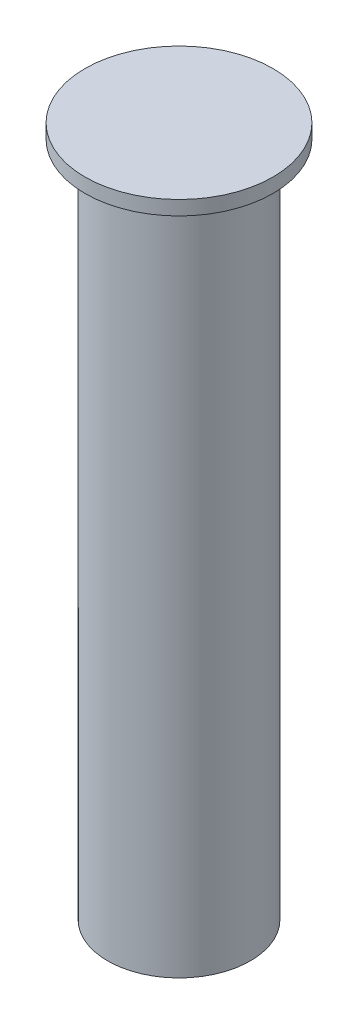
ISO-10303-21;
HEADER;
FILE_DESCRIPTION(('STEP AP214'),'2;1');
FILE_NAME('part.step','',(''),(''),'','','');
FILE_SCHEMA(('AUTOMOTIVE_DESIGN { 1 0 10303 214 1 1 1 1 }'));
ENDSEC;
DATA;
#1=APPLICATION_CONTEXT('core data for automotive mechanical design processes');
#2=APPLICATION_PROTOCOL_DEFINITION('international standard','automotive_design',2000,#1);
#3=PRODUCT_CONTEXT('',#1,'mechanical');
#4=PRODUCT('Part','Part','',(#3));
#5=PRODUCT_RELATED_PRODUCT_CATEGORY('part','',(#4));
#6=PRODUCT_DEFINITION_FORMATION('','',#4);
#7=PRODUCT_DEFINITION_CONTEXT('part definition',#1,'design');
#8=PRODUCT_DEFINITION('design','',#6,#7);
#9=PRODUCT_DEFINITION_SHAPE('','',#8);
#10=(LENGTH_UNIT() NAMED_UNIT(*) SI_UNIT(.MILLI.,.METRE.));
#11=(NAMED_UNIT(*) PLANE_ANGLE_UNIT() SI_UNIT($,.RADIAN.));
#12=(NAMED_UNIT(*) SI_UNIT($,.STERADIAN.) SOLID_ANGLE_UNIT());
#13=UNCERTAINTY_MEASURE_WITH_UNIT(LENGTH_MEASURE(1.E-05),#10,'distance_accuracy_value','');
#14=(GEOMETRIC_REPRESENTATION_CONTEXT(3) GLOBAL_UNCERTAINTY_ASSIGNED_CONTEXT((#13)) GLOBAL_UNIT_ASSIGNED_CONTEXT((#10,
#11,#12)) REPRESENTATION_CONTEXT('',''));
#15=CARTESIAN_POINT('',(0.,0.,0.));
#16=DIRECTION('',(0.,0.,1.));
#17=DIRECTION('',(1.,0.,0.));
#18=AXIS2_PLACEMENT_3D('',#15,#16,#17);
#19=CARTESIAN_POINT('',(0.,0.,0.));
#20=DIRECTION('',(0.,1.,0.));
#21=DIRECTION('',(-1.,0.,0.));
#22=AXIS2_PLACEMENT_3D('',#19,#20,#21);
#23=PLANE('',#22);
#24=CARTESIAN_POINT('',(0.,0.,0.));
#25=DIRECTION('',(0.,1.,0.));
#26=DIRECTION('',(-1.,0.,0.));
#27=AXIS2_PLACEMENT_3D('',#24,#25,#26);
#28=CIRCLE('',#27,19.75);
#29=CARTESIAN_POINT('',(-19.75,0.,0.));
#30=VERTEX_POINT('',#29);
#31=EDGE_CURVE('E10',#30,#30,#28,.T.);
#32=ORIENTED_EDGE('',*,*,#31,.T.);
#33=EDGE_LOOP('',(#32));
#34=FACE_BOUND('',#33,.T.);
#35=ADVANCED_FACE('F37',(#34),#23,.T.);
#36=CARTESIAN_POINT('',(0.,0.,0.));
#37=DIRECTION('',(0.,1.,0.));
#38=DIRECTION('',(-1.,0.,0.));
#39=AXIS2_PLACEMENT_3D('',#36,#37,#38);
#40=CYLINDRICAL_SURFACE('',#39,19.75);
#41=CARTESIAN_POINT('',(0.,-3.,0.));
#42=DIRECTION('',(0.,1.,0.));
#43=DIRECTION('',(-1.,0.,0.));
#44=AXIS2_PLACEMENT_3D('',#41,#42,#43);
#45=CIRCLE('',#44,19.75);
#46=CARTESIAN_POINT('',(-19.75,-3.,0.));
#47=VERTEX_POINT('',#46);
#48=EDGE_CURVE('E43',#47,#47,#45,.T.);
#49=ORIENTED_EDGE('',*,*,#48,.T.);
#50=EDGE_LOOP('',(#49));
#51=FACE_BOUND('',#50,.T.);
#52=ORIENTED_EDGE('',*,*,#31,.F.);
#53=EDGE_LOOP('',(#52));
#54=FACE_BOUND('',#53,.T.);
#55=ADVANCED_FACE('F69',(#51,#54),#40,.T.);
#56=CARTESIAN_POINT('',(-19.75,-3.,0.));
#57=DIRECTION('',(0.,-1.,0.));
#58=DIRECTION('',(1.,0.,0.));
#59=AXIS2_PLACEMENT_3D('',#56,#57,#58);
#60=PLANE('',#59);
#61=CARTESIAN_POINT('',(0.,-3.,0.));
#62=DIRECTION('',(0.,1.,0.));
#63=DIRECTION('',(-1.,0.,0.));
#64=AXIS2_PLACEMENT_3D('',#61,#62,#63);
#65=CIRCLE('',#64,15.);
#66=CARTESIAN_POINT('',(-15.,-3.,0.));
#67=VERTEX_POINT('',#66);
#68=EDGE_CURVE('E47',#67,#67,#65,.T.);
#69=ORIENTED_EDGE('',*,*,#68,.T.);
#70=EDGE_LOOP('',(#69));
#71=FACE_BOUND('',#70,.T.);
#72=ORIENTED_EDGE('',*,*,#48,.F.);
#73=EDGE_LOOP('',(#72));
#74=FACE_BOUND('',#73,.T.);
#75=ADVANCED_FACE('F66',(#71,#74),#60,.T.);
#76=CARTESIAN_POINT('',(0.,0.,0.));
#77=DIRECTION('',(0.,1.,0.));
#78=DIRECTION('',(-1.,0.,0.));
#79=AXIS2_PLACEMENT_3D('',#76,#77,#78);
#80=CYLINDRICAL_SURFACE('',#79,15.);
#81=CARTESIAN_POINT('',(0.,-145.,0.));
#82=DIRECTION('',(0.,1.,0.));
#83=DIRECTION('',(-1.,0.,0.));
#84=AXIS2_PLACEMENT_3D('',#81,#82,#83);
#85=CIRCLE('',#84,15.);
#86=CARTESIAN_POINT('',(-15.,-145.,0.));
#87=VERTEX_POINT('',#86);
#88=EDGE_CURVE('E51',#87,#87,#85,.T.);
#89=ORIENTED_EDGE('',*,*,#88,.T.);
#90=EDGE_LOOP('',(#89));
#91=FACE_BOUND('',#90,.T.);
#92=ORIENTED_EDGE('',*,*,#68,.F.);
#93=EDGE_LOOP('',(#92));
#94=FACE_BOUND('',#93,.T.);
#95=ADVANCED_FACE('F57',(#91,#94),#80,.T.);
#96=CARTESIAN_POINT('',(-15.,-145.,0.));
#97=DIRECTION('',(0.,-1.,0.));
#98=DIRECTION('',(1.,0.,0.));
#99=AXIS2_PLACEMENT_3D('',#96,#97,#98);
#100=PLANE('',#99);
#101=ORIENTED_EDGE('',*,*,#88,.F.);
#102=EDGE_LOOP('',(#101));
#103=FACE_BOUND('',#102,.T.);
#104=ADVANCED_FACE('F60',(#103),#100,.T.);
#105=CLOSED_SHELL('',(#35,#55,#75,#95,#104));
#106=MANIFOLD_SOLID_BREP('B2',#105);
#107=ADVANCED_BREP_SHAPE_REPRESENTATION('',(#18,#106),#14);
#108=SHAPE_DEFINITION_REPRESENTATION(#9,#107);
ENDSEC;
END-ISO-10303-21;
